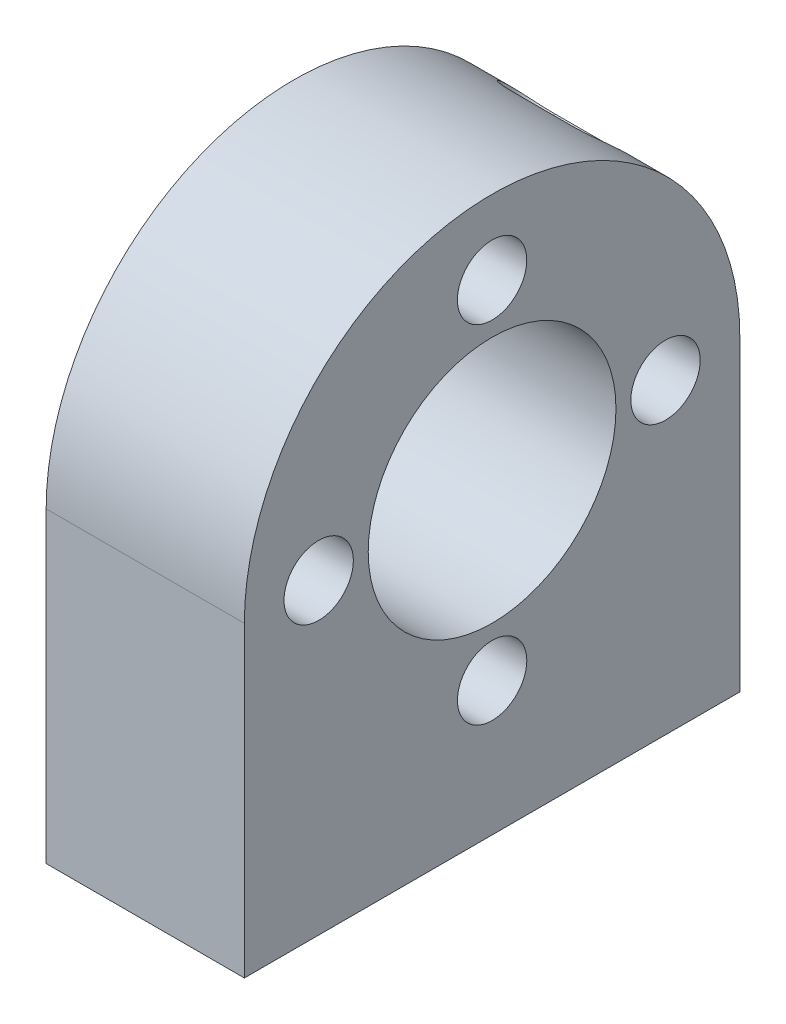
ISO-10303-21;
HEADER;
FILE_DESCRIPTION(('STEP AP214'),'2;1');
FILE_NAME('part.step','',(''),(''),'','','');
FILE_SCHEMA(('AUTOMOTIVE_DESIGN { 1 0 10303 214 1 1 1 1 }'));
ENDSEC;
DATA;
#1=APPLICATION_CONTEXT('core data for automotive mechanical design processes');
#2=APPLICATION_PROTOCOL_DEFINITION('international standard','automotive_design',2000,#1);
#3=PRODUCT_CONTEXT('',#1,'mechanical');
#4=PRODUCT('Part','Part','',(#3));
#5=PRODUCT_RELATED_PRODUCT_CATEGORY('part','',(#4));
#6=PRODUCT_DEFINITION_FORMATION('','',#4);
#7=PRODUCT_DEFINITION_CONTEXT('part definition',#1,'design');
#8=PRODUCT_DEFINITION('design','',#6,#7);
#9=PRODUCT_DEFINITION_SHAPE('','',#8);
#10=(LENGTH_UNIT() NAMED_UNIT(*) SI_UNIT(.MILLI.,.METRE.));
#11=(NAMED_UNIT(*) PLANE_ANGLE_UNIT() SI_UNIT($,.RADIAN.));
#12=(NAMED_UNIT(*) SI_UNIT($,.STERADIAN.) SOLID_ANGLE_UNIT());
#13=UNCERTAINTY_MEASURE_WITH_UNIT(LENGTH_MEASURE(1.E-05),#10,'distance_accuracy_value','');
#14=(GEOMETRIC_REPRESENTATION_CONTEXT(3) GLOBAL_UNCERTAINTY_ASSIGNED_CONTEXT((#13)) GLOBAL_UNIT_ASSIGNED_CONTEXT((#10,
#11,#12)) REPRESENTATION_CONTEXT('',''));
#15=CARTESIAN_POINT('',(0.,0.,0.));
#16=DIRECTION('',(0.,0.,1.));
#17=DIRECTION('',(1.,0.,0.));
#18=AXIS2_PLACEMENT_3D('',#15,#16,#17);
#19=CARTESIAN_POINT('',(10.,31.,17.5));
#20=DIRECTION('',(-1.,0.,0.));
#21=DIRECTION('',(0.,0.,1.));
#22=AXIS2_PLACEMENT_3D('',#19,#20,#21);
#23=CYLINDRICAL_SURFACE('',#22,2.00000000000001);
#24=CARTESIAN_POINT('',(-10.,31.,17.5));
#25=DIRECTION('',(-1.,0.,0.));
#26=DIRECTION('',(0.,0.,1.));
#27=AXIS2_PLACEMENT_3D('',#24,#25,#26);
#28=CIRCLE('',#27,2.00000000000001);
#29=CARTESIAN_POINT('',(-10.,31.,19.5));
#30=VERTEX_POINT('',#29);
#31=EDGE_CURVE('E339',#30,#30,#28,.T.);
#32=ORIENTED_EDGE('',*,*,#31,.T.);
#33=EDGE_LOOP('',(#32));
#34=FACE_BOUND('',#33,.T.);
#35=CARTESIAN_POINT('',(0.,31.,17.5));
#36=DIRECTION('',(1.,0.,0.));
#37=DIRECTION('',(0.,0.,-1.));
#38=AXIS2_PLACEMENT_3D('',#35,#36,#37);
#39=CIRCLE('',#38,2.00000000000001);
#40=CARTESIAN_POINT('',(0.,31.,15.5));
#41=VERTEX_POINT('',#40);
#42=EDGE_CURVE('E342',#41,#41,#39,.F.);
#43=ORIENTED_EDGE('',*,*,#42,.F.);
#44=EDGE_LOOP('',(#43));
#45=FACE_BOUND('',#44,.T.);
#46=ADVANCED_FACE('F111',(#34,#45),#23,.F.);
#47=CARTESIAN_POINT('',(10.,31.,-17.5));
#48=DIRECTION('',(-1.,0.,0.));
#49=DIRECTION('',(0.,0.,1.));
#50=AXIS2_PLACEMENT_3D('',#47,#48,#49);
#51=CYLINDRICAL_SURFACE('',#50,2.);
#52=CARTESIAN_POINT('',(-10.,31.,-17.5));
#53=DIRECTION('',(-1.,0.,0.));
#54=DIRECTION('',(0.,0.,1.));
#55=AXIS2_PLACEMENT_3D('',#52,#53,#54);
#56=CIRCLE('',#55,2.);
#57=CARTESIAN_POINT('',(-10.,31.,-15.5));
#58=VERTEX_POINT('',#57);
#59=EDGE_CURVE('E390',#58,#58,#56,.T.);
#60=ORIENTED_EDGE('',*,*,#59,.T.);
#61=EDGE_LOOP('',(#60));
#62=FACE_BOUND('',#61,.T.);
#63=CARTESIAN_POINT('',(0.,31.,-17.5));
#64=DIRECTION('',(1.,0.,0.));
#65=DIRECTION('',(0.,0.,-1.));
#66=AXIS2_PLACEMENT_3D('',#63,#64,#65);
#67=CIRCLE('',#66,2.);
#68=CARTESIAN_POINT('',(0.,31.,-19.5));
#69=VERTEX_POINT('',#68);
#70=EDGE_CURVE('E345',#69,#69,#67,.F.);
#71=ORIENTED_EDGE('',*,*,#70,.F.);
#72=EDGE_LOOP('',(#71));
#73=FACE_BOUND('',#72,.T.);
#74=ADVANCED_FACE('F326',(#62,#73),#51,.F.);
#75=CARTESIAN_POINT('',(10.,48.5,0.));
#76=DIRECTION('',(-1.,0.,0.));
#77=DIRECTION('',(0.,0.,1.));
#78=AXIS2_PLACEMENT_3D('',#75,#76,#77);
#79=CYLINDRICAL_SURFACE('',#78,2.00000000000001);
#80=CARTESIAN_POINT('',(-10.,48.5,0.));
#81=DIRECTION('',(-1.,0.,0.));
#82=DIRECTION('',(0.,0.,1.));
#83=AXIS2_PLACEMENT_3D('',#80,#81,#82);
#84=CIRCLE('',#83,2.00000000000001);
#85=CARTESIAN_POINT('',(-10.,48.5,2.));
#86=VERTEX_POINT('',#85);
#87=EDGE_CURVE('E387',#86,#86,#84,.T.);
#88=ORIENTED_EDGE('',*,*,#87,.T.);
#89=EDGE_LOOP('',(#88));
#90=FACE_BOUND('',#89,.T.);
#91=CARTESIAN_POINT('',(0.,48.5,0.));
#92=DIRECTION('',(1.,0.,0.));
#93=DIRECTION('',(0.,0.,-1.));
#94=AXIS2_PLACEMENT_3D('',#91,#92,#93);
#95=CIRCLE('',#94,2.00000000000001);
#96=CARTESIAN_POINT('',(0.,48.5,-2.00000000000001));
#97=VERTEX_POINT('',#96);
#98=EDGE_CURVE('E350',#97,#97,#95,.F.);
#99=ORIENTED_EDGE('',*,*,#98,.F.);
#100=EDGE_LOOP('',(#99));
#101=FACE_BOUND('',#100,.T.);
#102=ADVANCED_FACE('F237',(#90,#101),#79,.F.);
#103=CARTESIAN_POINT('',(10.,13.5,0.));
#104=DIRECTION('',(-1.,0.,0.));
#105=DIRECTION('',(0.,0.,1.));
#106=AXIS2_PLACEMENT_3D('',#103,#104,#105);
#107=CYLINDRICAL_SURFACE('',#106,2.00000000000001);
#108=CARTESIAN_POINT('',(-10.,13.5,0.));
#109=DIRECTION('',(-1.,0.,0.));
#110=DIRECTION('',(0.,0.,1.));
#111=AXIS2_PLACEMENT_3D('',#108,#109,#110);
#112=CIRCLE('',#111,2.00000000000001);
#113=CARTESIAN_POINT('',(-10.,13.5,2.00000000000001));
#114=VERTEX_POINT('',#113);
#115=EDGE_CURVE('E392',#114,#114,#112,.T.);
#116=ORIENTED_EDGE('',*,*,#115,.T.);
#117=EDGE_LOOP('',(#116));
#118=FACE_BOUND('',#117,.T.);
#119=CARTESIAN_POINT('',(0.,13.5,0.));
#120=DIRECTION('',(1.,0.,0.));
#121=DIRECTION('',(0.,0.,-1.));
#122=AXIS2_PLACEMENT_3D('',#119,#120,#121);
#123=CIRCLE('',#122,2.00000000000001);
#124=CARTESIAN_POINT('',(0.,13.5,-2.00000000000001));
#125=VERTEX_POINT('',#124);
#126=EDGE_CURVE('E355',#125,#125,#123,.F.);
#127=ORIENTED_EDGE('',*,*,#126,.F.);
#128=EDGE_LOOP('',(#127));
#129=FACE_BOUND('',#128,.T.);
#130=ADVANCED_FACE('F317',(#118,#129),#107,.F.);
#131=CARTESIAN_POINT('',(0.,0.,0.));
#132=DIRECTION('',(0.,-1.,0.));
#133=DIRECTION('',(0.,0.,-1.));
#134=AXIS2_PLACEMENT_3D('',#131,#132,#133);
#135=PLANE('',#134);
#136=CARTESIAN_POINT('',(0.,0.,-9.));
#137=DIRECTION('',(0.,1.,0.));
#138=DIRECTION('',(0.,0.,1.));
#139=AXIS2_PLACEMENT_3D('',#136,#137,#138);
#140=CIRCLE('',#139,1.65);
#141=CARTESIAN_POINT('',(0.,0.,-7.35));
#142=VERTEX_POINT('',#141);
#143=EDGE_CURVE('E408',#142,#142,#140,.T.);
#144=ORIENTED_EDGE('',*,*,#143,.T.);
#145=EDGE_LOOP('',(#144));
#146=FACE_BOUND('',#145,.T.);
#147=CARTESIAN_POINT('',(0.,0.,-19.));
#148=DIRECTION('',(0.,1.,0.));
#149=DIRECTION('',(0.,0.,1.));
#150=AXIS2_PLACEMENT_3D('',#147,#148,#149);
#151=CIRCLE('',#150,1.65);
#152=CARTESIAN_POINT('',(0.,0.,-17.35));
#153=VERTEX_POINT('',#152);
#154=EDGE_CURVE('E347',#153,#153,#151,.T.);
#155=ORIENTED_EDGE('',*,*,#154,.T.);
#156=EDGE_LOOP('',(#155));
#157=FACE_BOUND('',#156,.T.);
#158=DIRECTION('',(0.,0.,-1.));
#159=VECTOR('',#158,1.);
#160=CARTESIAN_POINT('',(10.,0.,25.));
#161=LINE('',#160,#159);
#162=CARTESIAN_POINT('',(10.,0.,25.));
#163=VERTEX_POINT('',#162);
#164=CARTESIAN_POINT('',(10.,0.,-25.));
#165=VERTEX_POINT('',#164);
#166=EDGE_CURVE('E374',#163,#165,#161,.T.);
#167=ORIENTED_EDGE('',*,*,#166,.F.);
#168=DIRECTION('',(1.,0.,0.));
#169=VECTOR('',#168,1.);
#170=CARTESIAN_POINT('',(-10.,0.,25.));
#171=LINE('',#170,#169);
#172=CARTESIAN_POINT('',(-10.,0.,25.));
#173=VERTEX_POINT('',#172);
#174=EDGE_CURVE('E365',#173,#163,#171,.T.);
#175=ORIENTED_EDGE('',*,*,#174,.F.);
#176=DIRECTION('',(0.,0.,1.));
#177=VECTOR('',#176,1.);
#178=CARTESIAN_POINT('',(-10.,0.,25.));
#179=LINE('',#178,#177);
#180=CARTESIAN_POINT('',(-10.,0.,-25.));
#181=VERTEX_POINT('',#180);
#182=EDGE_CURVE('E368',#181,#173,#179,.T.);
#183=ORIENTED_EDGE('',*,*,#182,.F.);
#184=DIRECTION('',(-1.,0.,0.));
#185=VECTOR('',#184,1.);
#186=CARTESIAN_POINT('',(-10.,0.,-25.));
#187=LINE('',#186,#185);
#188=EDGE_CURVE('E371',#165,#181,#187,.T.);
#189=ORIENTED_EDGE('',*,*,#188,.F.);
#190=EDGE_LOOP('',(#167,#175,#183,#189));
#191=FACE_BOUND('',#190,.T.);
#192=CARTESIAN_POINT('',(0.,0.,9.));
#193=DIRECTION('',(0.,-1.,0.));
#194=DIRECTION('',(0.,0.,-1.));
#195=AXIS2_PLACEMENT_3D('',#192,#193,#194);
#196=CIRCLE('',#195,1.65);
#197=CARTESIAN_POINT('',(0.,0.,7.35));
#198=VERTEX_POINT('',#197);
#199=EDGE_CURVE('E414',#198,#198,#196,.T.);
#200=ORIENTED_EDGE('',*,*,#199,.F.);
#201=EDGE_LOOP('',(#200));
#202=FACE_BOUND('',#201,.T.);
#203=CARTESIAN_POINT('',(0.,0.,19.));
#204=DIRECTION('',(0.,-1.,0.));
#205=DIRECTION('',(0.,0.,-1.));
#206=AXIS2_PLACEMENT_3D('',#203,#204,#205);
#207=CIRCLE('',#206,1.65);
#208=CARTESIAN_POINT('',(0.,0.,17.35));
#209=VERTEX_POINT('',#208);
#210=EDGE_CURVE('E417',#209,#209,#207,.T.);
#211=ORIENTED_EDGE('',*,*,#210,.F.);
#212=EDGE_LOOP('',(#211));
#213=FACE_BOUND('',#212,.T.);
#214=ADVANCED_FACE('F239',(#146,#157,#191,#202,#213),#135,.T.);
#215=CARTESIAN_POINT('',(10.,56.,25.));
#216=DIRECTION('',(-1.,0.,0.));
#217=DIRECTION('',(0.,0.,1.));
#218=AXIS2_PLACEMENT_3D('',#215,#216,#217);
#219=PLANE('',#218);
#220=CARTESIAN_POINT('',(10.,48.4983339335858,0.00166606641422568));
#221=DIRECTION('',(1.,0.,0.));
#222=DIRECTION('',(0.,0.,-1.));
#223=AXIS2_PLACEMENT_3D('',#220,#221,#222);
#224=CIRCLE('',#223,3.49999999999999);
#225=CARTESIAN_POINT('',(10.,48.4983339335858,-3.49833393358577));
#226=VERTEX_POINT('',#225);
#227=EDGE_CURVE('E438',#226,#226,#224,.T.);
#228=ORIENTED_EDGE('',*,*,#227,.F.);
#229=EDGE_LOOP('',(#228));
#230=FACE_BOUND('',#229,.T.);
#231=CARTESIAN_POINT('',(10.,31.,-17.5));
#232=DIRECTION('',(1.,0.,0.));
#233=DIRECTION('',(0.,0.,-1.));
#234=AXIS2_PLACEMENT_3D('',#231,#232,#233);
#235=CIRCLE('',#234,3.5);
#236=CARTESIAN_POINT('',(10.,31.,-21.));
#237=VERTEX_POINT('',#236);
#238=EDGE_CURVE('E436',#237,#237,#235,.T.);
#239=ORIENTED_EDGE('',*,*,#238,.F.);
#240=EDGE_LOOP('',(#239));
#241=FACE_BOUND('',#240,.T.);
#242=CARTESIAN_POINT('',(10.,13.4983339335858,-0.00166606641422351));
#243=DIRECTION('',(1.,0.,0.));
#244=DIRECTION('',(0.,0.,-1.));
#245=AXIS2_PLACEMENT_3D('',#242,#243,#244);
#246=CIRCLE('',#245,3.5);
#247=CARTESIAN_POINT('',(10.,13.4983339335858,-3.50166606641422));
#248=VERTEX_POINT('',#247);
#249=EDGE_CURVE('E430',#248,#248,#246,.T.);
#250=ORIENTED_EDGE('',*,*,#249,.F.);
#251=EDGE_LOOP('',(#250));
#252=FACE_BOUND('',#251,.T.);
#253=CARTESIAN_POINT('',(10.,30.9966678671715,17.5));
#254=DIRECTION('',(1.,0.,0.));
#255=DIRECTION('',(0.,0.,-1.));
#256=AXIS2_PLACEMENT_3D('',#253,#254,#255);
#257=CIRCLE('',#256,3.5);
#258=CARTESIAN_POINT('',(10.,30.9966678671715,14.));
#259=VERTEX_POINT('',#258);
#260=EDGE_CURVE('E424',#259,#259,#257,.T.);
#261=ORIENTED_EDGE('',*,*,#260,.F.);
#262=EDGE_LOOP('',(#261));
#263=FACE_BOUND('',#262,.T.);
#264=CARTESIAN_POINT('',(10.,31.,0.));
#265=DIRECTION('',(-1.,0.,0.));
#266=DIRECTION('',(0.,0.,1.));
#267=AXIS2_PLACEMENT_3D('',#264,#265,#266);
#268=CIRCLE('',#267,12.5);
#269=CARTESIAN_POINT('',(10.,31.,12.5));
#270=VERTEX_POINT('',#269);
#271=EDGE_CURVE('E395',#270,#270,#268,.T.);
#272=ORIENTED_EDGE('',*,*,#271,.T.);
#273=EDGE_LOOP('',(#272));
#274=FACE_BOUND('',#273,.T.);
#275=DIRECTION('',(0.,-1.,0.));
#276=VECTOR('',#275,1.);
#277=CARTESIAN_POINT('',(10.,56.,-25.));
#278=LINE('',#277,#276);
#279=CARTESIAN_POINT('',(10.,31.,-25.));
#280=VERTEX_POINT('',#279);
#281=EDGE_CURVE('E189',#280,#165,#278,.T.);
#282=ORIENTED_EDGE('',*,*,#281,.F.);
#283=CARTESIAN_POINT('',(10.,31.,0.));
#284=DIRECTION('',(-1.,0.,0.));
#285=DIRECTION('',(0.,0.,1.));
#286=AXIS2_PLACEMENT_3D('',#283,#284,#285);
#287=CIRCLE('',#286,25.);
#288=CARTESIAN_POINT('',(10.,31.,25.));
#289=VERTEX_POINT('',#288);
#290=EDGE_CURVE('E380',#289,#280,#287,.T.);
#291=ORIENTED_EDGE('',*,*,#290,.F.);
#292=DIRECTION('',(0.,-1.,0.));
#293=VECTOR('',#292,1.);
#294=CARTESIAN_POINT('',(10.,56.,25.));
#295=LINE('',#294,#293);
#296=EDGE_CURVE('E363',#289,#163,#295,.T.);
#297=ORIENTED_EDGE('',*,*,#296,.T.);
#298=ORIENTED_EDGE('',*,*,#166,.T.);
#299=EDGE_LOOP('',(#282,#291,#297,#298));
#300=FACE_BOUND('',#299,.T.);
#301=ADVANCED_FACE('F113',(#230,#241,#252,#263,#274,#300),#219,.F.);
#302=CARTESIAN_POINT('',(-10.,56.,25.));
#303=DIRECTION('',(1.,0.,0.));
#304=DIRECTION('',(0.,0.,-1.));
#305=AXIS2_PLACEMENT_3D('',#302,#303,#304);
#306=PLANE('',#305);
#307=CARTESIAN_POINT('',(-10.,31.,0.));
#308=DIRECTION('',(-1.,0.,0.));
#309=DIRECTION('',(0.,0.,1.));
#310=AXIS2_PLACEMENT_3D('',#307,#308,#309);
#311=CIRCLE('',#310,12.5);
#312=CARTESIAN_POINT('',(-10.,31.,12.5));
#313=VERTEX_POINT('',#312);
#314=EDGE_CURVE('E398',#313,#313,#311,.T.);
#315=ORIENTED_EDGE('',*,*,#314,.F.);
#316=EDGE_LOOP('',(#315));
#317=FACE_BOUND('',#316,.T.);
#318=ORIENTED_EDGE('',*,*,#115,.F.);
#319=EDGE_LOOP('',(#318));
#320=FACE_BOUND('',#319,.T.);
#321=ORIENTED_EDGE('',*,*,#87,.F.);
#322=EDGE_LOOP('',(#321));
#323=FACE_BOUND('',#322,.T.);
#324=ORIENTED_EDGE('',*,*,#31,.F.);
#325=EDGE_LOOP('',(#324));
#326=FACE_BOUND('',#325,.T.);
#327=ORIENTED_EDGE('',*,*,#59,.F.);
#328=EDGE_LOOP('',(#327));
#329=FACE_BOUND('',#328,.T.);
#330=CARTESIAN_POINT('',(-10.,31.,0.));
#331=DIRECTION('',(-1.,0.,0.));
#332=DIRECTION('',(0.,0.,1.));
#333=AXIS2_PLACEMENT_3D('',#330,#331,#332);
#334=CIRCLE('',#333,25.);
#335=CARTESIAN_POINT('',(-10.,31.,25.));
#336=VERTEX_POINT('',#335);
#337=CARTESIAN_POINT('',(-10.,31.,-25.));
#338=VERTEX_POINT('',#337);
#339=EDGE_CURVE('E381',#336,#338,#334,.T.);
#340=ORIENTED_EDGE('',*,*,#339,.T.);
#341=DIRECTION('',(0.,-1.,0.));
#342=VECTOR('',#341,1.);
#343=CARTESIAN_POINT('',(-10.,56.,-25.));
#344=LINE('',#343,#342);
#345=EDGE_CURVE('E359',#338,#181,#344,.T.);
#346=ORIENTED_EDGE('',*,*,#345,.T.);
#347=ORIENTED_EDGE('',*,*,#182,.T.);
#348=DIRECTION('',(0.,-1.,0.));
#349=VECTOR('',#348,1.);
#350=CARTESIAN_POINT('',(-10.,56.,25.));
#351=LINE('',#350,#349);
#352=EDGE_CURVE('E361',#336,#173,#351,.T.);
#353=ORIENTED_EDGE('',*,*,#352,.F.);
#354=EDGE_LOOP('',(#340,#346,#347,#353));
#355=FACE_BOUND('',#354,.T.);
#356=ADVANCED_FACE('F449',(#317,#320,#323,#326,#329,#355),#306,.F.);
#357=CARTESIAN_POINT('',(-10.,56.,-25.));
#358=DIRECTION('',(0.,0.,1.));
#359=DIRECTION('',(1.,0.,0.));
#360=AXIS2_PLACEMENT_3D('',#357,#358,#359);
#361=PLANE('',#360);
#362=DIRECTION('',(-1.,0.,0.));
#363=VECTOR('',#362,1.);
#364=CARTESIAN_POINT('',(10.,31.,-25.));
#365=LINE('',#364,#363);
#366=EDGE_CURVE('E383',#280,#338,#365,.T.);
#367=ORIENTED_EDGE('',*,*,#366,.F.);
#368=ORIENTED_EDGE('',*,*,#281,.T.);
#369=ORIENTED_EDGE('',*,*,#188,.T.);
#370=ORIENTED_EDGE('',*,*,#345,.F.);
#371=EDGE_LOOP('',(#367,#368,#369,#370));
#372=FACE_BOUND('',#371,.T.);
#373=ADVANCED_FACE('F465',(#372),#361,.F.);
#374=CARTESIAN_POINT('',(-10.,56.,25.));
#375=DIRECTION('',(0.,0.,-1.));
#376=DIRECTION('',(-1.,0.,0.));
#377=AXIS2_PLACEMENT_3D('',#374,#375,#376);
#378=PLANE('',#377);
#379=ORIENTED_EDGE('',*,*,#296,.F.);
#380=DIRECTION('',(-1.,0.,0.));
#381=VECTOR('',#380,1.);
#382=CARTESIAN_POINT('',(10.,31.,25.));
#383=LINE('',#382,#381);
#384=EDGE_CURVE('E377',#289,#336,#383,.T.);
#385=ORIENTED_EDGE('',*,*,#384,.T.);
#386=ORIENTED_EDGE('',*,*,#352,.T.);
#387=ORIENTED_EDGE('',*,*,#174,.T.);
#388=EDGE_LOOP('',(#379,#385,#386,#387));
#389=FACE_BOUND('',#388,.T.);
#390=ADVANCED_FACE('F235',(#389),#378,.F.);
#391=CARTESIAN_POINT('',(10.,31.,0.));
#392=DIRECTION('',(-1.,0.,0.));
#393=DIRECTION('',(0.,0.,1.));
#394=AXIS2_PLACEMENT_3D('',#391,#392,#393);
#395=CYLINDRICAL_SURFACE('',#394,25.);
#396=CARTESIAN_POINT('',(-3.,46.8832134946128,-19.3060490283369));
#397=CARTESIAN_POINT('',(-3.08418375775556,46.8832047826232,-19.3060520780563));
#398=CARTESIAN_POINT('',(-3.16836337808511,46.8859627166025,-19.3037871184803));
#399=CARTESIAN_POINT('',(-3.3361161175217,46.8969454538205,-19.2947458619569));
#400=CARTESIAN_POINT('',(-3.41968927693515,46.9051698903192,-19.2879698676485));
#401=CARTESIAN_POINT('',(-3.58556738376024,46.9270093601832,-19.269939362267));
#402=CARTESIAN_POINT('',(-3.66787340835581,46.940619518481,-19.2586889013615));
#403=CARTESIAN_POINT('',(-3.83068483952999,46.9730853445921,-19.2317702010613));
#404=CARTESIAN_POINT('',(-3.91119026049871,46.9919409704682,-19.216101996986));
#405=CARTESIAN_POINT('',(-4.14921421651808,47.0561539977386,-19.1625435697927));
#406=CARTESIAN_POINT('',(-4.30332604633585,47.1091689638531,-19.1180902504939));
#407=CARTESIAN_POINT('',(-4.59769699536192,47.2335733539294,-19.0125669609478));
#408=CARTESIAN_POINT('',(-4.73795775281242,47.3049606012905,-18.9514989590258));
#409=CARTESIAN_POINT('',(-5.0012510051771,47.4638067694599,-18.8136686551455));
#410=CARTESIAN_POINT('',(-5.12423000945276,47.5513137331495,-18.7368593590297));
#411=CARTESIAN_POINT('',(-5.34898150174102,47.7391988342958,-18.5691960876162));
#412=CARTESIAN_POINT('',(-5.45075095238441,47.8395788119457,-18.4783401039669));
#413=CARTESIAN_POINT('',(-5.63025594488004,48.0498875251657,-18.2844681585581));
#414=CARTESIAN_POINT('',(-5.70797066110408,48.1598244298731,-18.1814417661552));
#415=CARTESIAN_POINT('',(-5.83699313146028,48.3855411522417,-17.9657257136406));
#416=CARTESIAN_POINT('',(-5.88830345890687,48.5013203993129,-17.8530369964473));
#417=CARTESIAN_POINT('',(-5.9628500617051,48.7344729958298,-17.6214448828763));
#418=CARTESIAN_POINT('',(-5.98622400732308,48.8518356214705,-17.5025749999293));
#419=CARTESIAN_POINT('',(-6.00470142631358,49.085191302696,-17.2613444547566));
#420=CARTESIAN_POINT('',(-5.99980490237811,49.2011843584113,-17.1389837928634));
#421=CARTESIAN_POINT('',(-5.96198550935177,49.4281762513313,-16.8946751570166));
#422=CARTESIAN_POINT('',(-5.92914826654756,49.5391892572132,-16.7727270638204));
#423=CARTESIAN_POINT('',(-5.83655379197852,49.7537172074472,-16.5325146771091));
#424=CARTESIAN_POINT('',(-5.77679581994377,49.8572319455199,-16.41425048499));
#425=CARTESIAN_POINT('',(-5.63172821571131,50.0547873152275,-16.1845040367685));
#426=CARTESIAN_POINT('',(-5.54629391605513,50.1487786604562,-16.0730581378339));
#427=CARTESIAN_POINT('',(-5.35239441329622,50.3246396463619,-15.8611881160996));
#428=CARTESIAN_POINT('',(-5.24392908461144,50.4065092209379,-15.7607640534036));
#429=CARTESIAN_POINT('',(-5.00616738837021,50.5569749845047,-15.5736722687983));
#430=CARTESIAN_POINT('',(-4.87673660676872,50.6254787779388,-15.4871010004052));
#431=CARTESIAN_POINT('',(-4.60111486167322,50.7472185317516,-15.3315736398305));
#432=CARTESIAN_POINT('',(-4.45491903484878,50.8004500460709,-15.2626226779023));
#433=CARTESIAN_POINT('',(-4.15009904046811,50.8905737700195,-15.1449853896256));
#434=CARTESIAN_POINT('',(-3.99148809517787,50.9274830916642,-15.0962778435332));
#435=CARTESIAN_POINT('',(-3.66632020500733,50.9843211185148,-15.0209578291292));
#436=CARTESIAN_POINT('',(-3.49977595373919,51.0042760475056,-14.9943112402198));
#437=CARTESIAN_POINT('',(-3.27670424522639,51.0193112094427,-14.9742176180266));
#438=CARTESIAN_POINT('',(-3.22141703329904,51.0220965450553,-14.9704928051049));
#439=CARTESIAN_POINT('',(-3.11076099945255,51.02580543627,-14.9655314285981));
#440=CARTESIAN_POINT('',(-3.05539246644724,51.0267320823728,-14.9642907345976));
#441=CARTESIAN_POINT('',(-3.,51.0267340739208,-14.9642882334063));
#442=B_SPLINE_CURVE_WITH_KNOTS('',3,(#396,#397,#398,#399,#400,#401,#402,#403,#404,#405,#406,
#407,#408,#409,#410,#411,#412,#413,#414,#415,#416,#417,#418,#419,#420,#421,#422,#423,#424,#425,
#426,#427,#428,#429,#430,#431,#432,#433,#434,#435,#436,#437,#438,#439,#440,#441),.UNSPECIFIED.,
.F.,.F.,(4,2,2,2,2,2,2,2,2,2,2,2,2,2,2,2,2,2,2,2,2,2,4),(0.,0.252468265182436,0.504919594329395,
0.757142929466035,1.00936424815774,1.51354959654159,2.01767524056043,2.52332842105916,
3.02905396525125,3.53521612961468,4.04132895516532,4.5449372393727,5.04854547562478,
5.5506159048671,6.05270014095388,6.55726267313479,7.06182795663109,7.56976640956878,
8.0778525836368,8.58540481531502,9.09217056661027,9.25855538912025,9.42466332832176),.UNSPECIFIED.);
#443=CARTESIAN_POINT('',(-3.,46.8832134946128,-19.3060490283369));
#444=VERTEX_POINT('',#443);
#445=CARTESIAN_POINT('',(-3.,51.0267340739208,-14.9642882334063));
#446=VERTEX_POINT('',#445);
#447=EDGE_CURVE('E219',#444,#446,#442,.T.);
#448=ORIENTED_EDGE('',*,*,#447,.F.);
#449=DIRECTION('',(-1.,0.,0.));
#450=VECTOR('',#449,1.);
#451=CARTESIAN_POINT('',(10.,46.8832134946128,-19.3060490283369));
#452=LINE('',#451,#450);
#453=CARTESIAN_POINT('',(3.,46.8832134946128,-19.3060490283369));
#454=VERTEX_POINT('',#453);
#455=EDGE_CURVE('E228',#454,#444,#452,.T.);
#456=ORIENTED_EDGE('',*,*,#455,.F.);
#457=CARTESIAN_POINT('',(3.,51.0267340739208,-14.9642882334063));
#458=CARTESIAN_POINT('',(3.08389198581703,51.0267369993281,-14.9642790234467));
#459=CARTESIAN_POINT('',(3.16777959811744,51.0246057916518,-14.9671363806832));
#460=CARTESIAN_POINT('',(3.33494664488822,51.0160988197588,-14.9785139584428));
#461=CARTESIAN_POINT('',(3.41822612953662,51.0097234098352,-14.9870337062869));
#462=CARTESIAN_POINT('',(3.58350008933643,50.9927611370657,-15.009653279075));
#463=CARTESIAN_POINT('',(3.66549588591225,50.9821789478493,-15.02374691148));
#464=CARTESIAN_POINT('',(3.82769028397071,50.9568606758563,-15.0573620098825));
#465=CARTESIAN_POINT('',(3.90788889383359,50.9421246124535,-15.0768834505648));
#466=CARTESIAN_POINT('',(4.14498951440969,50.8917576557962,-15.143352227037));
#467=CARTESIAN_POINT('',(4.29849531110192,50.8499578598056,-15.1982177463289));
#468=CARTESIAN_POINT('',(4.59175826863894,50.750730872472,-15.3269432185865));
#469=CARTESIAN_POINT('',(4.73151614475344,50.6933044947268,-15.4008021826478));
#470=CARTESIAN_POINT('',(4.99441305316411,50.5634568979301,-15.5654162663251));
#471=CARTESIAN_POINT('',(5.11744291291566,50.4909443244702,-15.6562739673951));
#472=CARTESIAN_POINT('',(5.34244508583619,50.3325474940411,-15.8514470388612));
#473=CARTESIAN_POINT('',(5.44441396075565,50.2466610577687,-15.9557646020987));
#474=CARTESIAN_POINT('',(5.62495449835786,50.0627792400172,-16.1750116781339));
#475=CARTESIAN_POINT('',(5.70338925606925,49.9647175247367,-16.2899983771891));
#476=CARTESIAN_POINT('',(5.83379294682896,49.7591293113462,-16.5263295694398));
#477=CARTESIAN_POINT('',(5.88576417421311,49.6516036346914,-16.6476735104685));
#478=CARTESIAN_POINT('',(5.96153332966205,49.430244027068,-16.8924006484933));
#479=CARTESIAN_POINT('',(5.98544828901029,49.316438388796,-17.0157731819643));
#480=CARTESIAN_POINT('',(6.00474639867403,49.0851980322517,-17.2613455106907));
#481=CARTESIAN_POINT('',(6.00013019946385,48.9677633967767,-17.3835453326189));
#482=CARTESIAN_POINT('',(5.9625995355915,48.7335192822216,-17.6224315327073));
#483=CARTESIAN_POINT('',(5.92988413737606,48.6167112084559,-17.7391506179708));
#484=CARTESIAN_POINT('',(5.83735382335122,48.3864469677517,-17.9648956190367));
#485=CARTESIAN_POINT('',(5.77753898909101,48.2729907907276,-18.0739215579888));
#486=CARTESIAN_POINT('',(5.63252681670056,48.053032476654,-18.2816024603267));
#487=CARTESIAN_POINT('',(5.54732988693123,47.9465302277596,-18.3802575905292));
#488=CARTESIAN_POINT('',(5.3539694080738,47.7439730727828,-18.564971971293));
#489=CARTESIAN_POINT('',(5.24580603678715,47.6479180858285,-18.6510313193595));
#490=CARTESIAN_POINT('',(5.00891063052378,47.4690323440081,-18.809182173921));
#491=CARTESIAN_POINT('',(4.88007302983911,47.3862740752511,-18.8811975474145));
#492=CARTESIAN_POINT('',(4.60580150834794,47.2375003421153,-19.0092939087069));
#493=CARTESIAN_POINT('',(4.46036257413398,47.1714899548978,-19.0653700651116));
#494=CARTESIAN_POINT('',(4.15666673660281,47.0585183540054,-19.1606232450781));
#495=CARTESIAN_POINT('',(3.99837939208759,47.0116040632924,-19.1997586565941));
#496=CARTESIAN_POINT('',(3.67388502352724,46.9388843052148,-19.2601723482646));
#497=CARTESIAN_POINT('',(3.50769006412075,46.9130477075517,-19.2814769644839));
#498=CARTESIAN_POINT('',(3.28358444396418,46.8932117612044,-19.2978195061564));
#499=CARTESIAN_POINT('',(3.22692571653686,46.8894610737906,-19.3009075707351));
#500=CARTESIAN_POINT('',(3.11351929590108,46.8844652369684,-19.3050195237831));
#501=CARTESIAN_POINT('',(3.05677191545126,46.8832158587293,-19.3060468961609));
#502=CARTESIAN_POINT('',(3.,46.8832134946128,-19.3060490283369));
#503=B_SPLINE_CURVE_WITH_KNOTS('',3,(#457,#458,#459,#460,#461,#462,#463,#464,#465,#466,#467,
#468,#469,#470,#471,#472,#473,#474,#475,#476,#477,#478,#479,#480,#481,#482,#483,#484,#485,#486,
#487,#488,#489,#490,#491,#492,#493,#494,#495,#496,#497,#498,#499,#500,#501,#502),.UNSPECIFIED.,
.F.,.F.,(4,2,2,2,2,2,2,2,2,2,2,2,2,2,2,2,2,2,2,2,2,2,4),(0.,0.251592498131182,0.503163996728254,
0.754456783114997,1.00574839748875,1.50803405502409,2.01029356606422,2.51568797300463,
3.02116482153193,3.52952757831306,4.03784625353925,4.54403695059598,5.05021610718754,
5.55283858210574,6.05545954451351,6.55807242091992,7.06068140634337,7.56594361316619,
8.07135880893682,8.57800852177195,9.08390858629327,9.25444082287423,9.42468450535557),.UNSPECIFIED.);
#504=CARTESIAN_POINT('',(3.,51.0267340739208,-14.9642882334063));
#505=VERTEX_POINT('',#504);
#506=EDGE_CURVE('E132',#505,#454,#503,.T.);
#507=ORIENTED_EDGE('',*,*,#506,.F.);
#508=DIRECTION('',(-1.,0.,0.));
#509=VECTOR('',#508,1.);
#510=CARTESIAN_POINT('',(10.,51.0267340739208,-14.9642882334063));
#511=LINE('',#510,#509);
#512=EDGE_CURVE('E227',#446,#505,#511,.F.);
#513=ORIENTED_EDGE('',*,*,#512,.F.);
#514=EDGE_LOOP('',(#448,#456,#507,#513));
#515=FACE_BOUND('',#514,.T.);
#516=ORIENTED_EDGE('',*,*,#339,.F.);
#517=ORIENTED_EDGE('',*,*,#384,.F.);
#518=ORIENTED_EDGE('',*,*,#290,.T.);
#519=ORIENTED_EDGE('',*,*,#366,.T.);
#520=EDGE_LOOP('',(#516,#517,#518,#519));
#521=FACE_BOUND('',#520,.T.);
#522=ADVANCED_FACE('F230',(#515,#521),#395,.T.);
#523=CARTESIAN_POINT('',(10.,31.,0.));
#524=DIRECTION('',(-1.,0.,0.));
#525=DIRECTION('',(0.,0.,1.));
#526=AXIS2_PLACEMENT_3D('',#523,#524,#525);
#527=CYLINDRICAL_SURFACE('',#526,12.5);
#528=DIRECTION('',(-1.,0.,0.));
#529=VECTOR('',#528,1.);
#530=CARTESIAN_POINT('',(10.,41.9998656998273,-5.93741985931293));
#531=LINE('',#530,#529);
#532=CARTESIAN_POINT('',(-3.,41.9998656998273,-5.93741985931293));
#533=VERTEX_POINT('',#532);
#534=CARTESIAN_POINT('',(3.,41.9998656998273,-5.93741985931293));
#535=VERTEX_POINT('',#534);
#536=EDGE_CURVE('E125',#533,#535,#531,.F.);
#537=ORIENTED_EDGE('',*,*,#536,.T.);
#538=CARTESIAN_POINT('',(3.,41.9998656998273,-5.93741985931293));
#539=CARTESIAN_POINT('',(3.08241616036997,41.9998660597908,-5.93740599881184));
#540=CARTESIAN_POINT('',(3.1648262265933,41.9981819754491,-5.94053885658263));
#541=CARTESIAN_POINT('',(3.32902346395505,41.9914498916535,-5.9529925938216));
#542=CARTESIAN_POINT('',(3.41081075416227,41.9864025524306,-5.96231225877404));
#543=CARTESIAN_POINT('',(3.57299708371188,41.9729644614828,-5.98700573003448));
#544=CARTESIAN_POINT('',(3.65339889251966,41.9645814567456,-6.00236550739181));
#545=CARTESIAN_POINT('',(3.81241784940072,41.9444880494928,-6.0389248460161));
#546=CARTESIAN_POINT('',(3.89103496270928,41.9327775822202,-6.06012452093498));
#547=CARTESIAN_POINT('',(4.12335512500341,41.8926712746231,-6.13210972158769));
#548=CARTESIAN_POINT('',(4.27371253734773,41.8592853424817,-6.19131031813219));
#549=CARTESIAN_POINT('',(4.56125852995755,41.7793854823035,-6.32938953878301));
#550=CARTESIAN_POINT('',(4.69844224917007,41.7328667330526,-6.40827538834408));
#551=CARTESIAN_POINT('',(4.95963506893814,41.6255639278527,-6.58470136952518));
#552=CARTESIAN_POINT('',(5.08322711359728,41.564451152184,-6.6826599850887));
#553=CARTESIAN_POINT('',(5.3100650761643,41.4290195383402,-6.89210293598487));
#554=CARTESIAN_POINT('',(5.41330688348123,41.3546980378583,-7.00358999662649));
#555=CARTESIAN_POINT('',(5.59895971698832,41.191601165509,-7.23893783772929));
#556=CARTESIAN_POINT('',(5.68080689010001,41.1025198359689,-7.36303257782677));
#557=CARTESIAN_POINT('',(5.81781245254677,40.9125783582579,-7.61681536178204));
#558=CARTESIAN_POINT('',(5.87297492764317,40.8117200162325,-7.74650254605267));
#559=CARTESIAN_POINT('',(5.95406516853337,40.601997914292,-8.00492798179487));
#560=CARTESIAN_POINT('',(5.98044478617647,40.4932873326574,-8.13364842334721));
#561=CARTESIAN_POINT('',(6.00447054603637,40.269298921305,-8.38801484249305));
#562=CARTESIAN_POINT('',(6.00212143226608,40.154022178995,-8.51366132426004));
#563=CARTESIAN_POINT('',(5.96909246266443,39.9237133407883,-8.75467673785125));
#564=CARTESIAN_POINT('',(5.93920621108499,39.8087644451421,-8.87023476326151));
#565=CARTESIAN_POINT('',(5.8530783508089,39.579711939866,-9.09197247892491));
#566=CARTESIAN_POINT('',(5.79683705453385,39.4656083202323,-9.19815228033295));
#567=CARTESIAN_POINT('',(5.65977448569851,39.2423344452907,-9.39874661467182));
#568=CARTESIAN_POINT('',(5.57899206034436,39.1331567040483,-9.49317941184408));
#569=CARTESIAN_POINT('',(5.39510386621239,38.9233982074696,-9.66894584586018));
#570=CARTESIAN_POINT('',(5.29199583294346,38.8228183256604,-9.75027815245807));
#571=CARTESIAN_POINT('',(5.0638859066213,38.6319969085532,-9.90038833282585));
#572=CARTESIAN_POINT('',(4.93847549025318,38.5420120642098,-9.96887193022337));
#573=CARTESIAN_POINT('',(4.67061881489782,38.3784472704655,-10.090537165335));
#574=CARTESIAN_POINT('',(4.52816771544028,38.304871999347,-10.1437144405502));
#575=CARTESIAN_POINT('',(4.22863337964213,38.176684803643,-10.2348162633024));
#576=CARTESIAN_POINT('',(4.07141919492003,38.122267916961,-10.2725845253362));
#577=CARTESIAN_POINT('',(3.74808900673878,38.0360474114249,-10.3318350719328));
#578=CARTESIAN_POINT('',(3.58198535435296,38.0042132503965,-10.3533393554493));
#579=CARTESIAN_POINT('',(3.34539288310005,37.9763434028116,-10.3721116045894));
#580=CARTESIAN_POINT('',(3.27645717924804,37.970270701797,-10.3761916689369));
#581=CARTESIAN_POINT('',(3.13835831571295,37.9621768823377,-10.3816238309402));
#582=CARTESIAN_POINT('',(3.06919573715343,37.9601489354992,-10.3829805262396));
#583=CARTESIAN_POINT('',(3.,37.9601477911711,-10.3829833248954));
#584=B_SPLINE_CURVE_WITH_KNOTS('',3,(#538,#539,#540,#541,#542,#543,#544,#545,#546,#547,#548,
#549,#550,#551,#552,#553,#554,#555,#556,#557,#558,#559,#560,#561,#562,#563,#564,#565,#566,#567,
#568,#569,#570,#571,#572,#573,#574,#575,#576,#577,#578,#579,#580,#581,#582,#583),.UNSPECIFIED.,
.F.,.F.,(4,2,2,2,2,2,2,2,2,2,2,2,2,2,2,2,2,2,2,2,2,2,4),(0.,0.247161320152576,0.494274135062891,
0.740816356324838,0.987363375955018,1.47989935265079,1.97261638084506,2.4776992765418,
2.98288409077318,3.50028040327398,4.01759747082797,4.52667101851303,5.03566050335428,
5.53042507551238,6.02518378271254,6.51916336026096,7.01319306575271,7.5174352066177,
8.02182092100086,8.5312022685683,9.03989337930288,9.2477227922872,9.4552010476203),.UNSPECIFIED.);
#585=CARTESIAN_POINT('',(3.,37.9601477911711,-10.3829833248954));
#586=VERTEX_POINT('',#585);
#587=EDGE_CURVE('E12',#535,#586,#584,.T.);
#588=ORIENTED_EDGE('',*,*,#587,.T.);
#589=DIRECTION('',(-1.,0.,0.));
#590=VECTOR('',#589,1.);
#591=CARTESIAN_POINT('',(10.,37.9601477911711,-10.3829833248954));
#592=LINE('',#591,#590);
#593=CARTESIAN_POINT('',(-3.,37.9601477911711,-10.3829833248954));
#594=VERTEX_POINT('',#593);
#595=EDGE_CURVE('E182',#586,#594,#592,.T.);
#596=ORIENTED_EDGE('',*,*,#595,.T.);
#597=CARTESIAN_POINT('',(-3.,37.9601477911712,-10.3829833248954));
#598=CARTESIAN_POINT('',(-3.08359913054272,37.9601355822787,-10.3829838674927));
#599=CARTESIAN_POINT('',(-3.16719318348924,37.9631061669601,-10.381000007805));
#600=CARTESIAN_POINT('',(-3.33376591524486,37.9749203185888,-10.3730698990784));
#601=CARTESIAN_POINT('',(-3.41674467043001,37.9837631438522,-10.3671241504394));
#602=CARTESIAN_POINT('',(-3.58137930130204,38.0072115968551,-10.3512885743913));
#603=CARTESIAN_POINT('',(-3.66303697632292,38.0218085512377,-10.3414046828133));
#604=CARTESIAN_POINT('',(-3.82455527267291,38.0565718674314,-10.3177144850154));
#605=CARTESIAN_POINT('',(-3.90441588512587,38.0767382567448,-10.3039081594263));
#606=CARTESIAN_POINT('',(-4.1404807426438,38.14527079503,-10.2566189259209));
#607=CARTESIAN_POINT('',(-4.29329940075362,38.2016894132151,-10.217253270449));
#608=CARTESIAN_POINT('',(-4.5853657563175,38.3334007192344,-10.1231290964543));
#609=CARTESIAN_POINT('',(-4.72461192748197,38.4086955263913,-10.0683688494209));
#610=CARTESIAN_POINT('',(-4.98754628557988,38.5760388502574,-9.94307129399788));
#611=CARTESIAN_POINT('',(-5.11102523045285,38.6682795387724,-9.87235064004963));
#612=CARTESIAN_POINT('',(-5.33703030330298,38.8651855237175,-9.71620375136309));
#613=CARTESIAN_POINT('',(-5.43955392790619,38.9698523022404,-9.63077576189359));
#614=CARTESIAN_POINT('',(-5.62107257608782,39.1880127495215,-9.44600061741173));
#615=CARTESIAN_POINT('',(-5.69997607093498,39.3015386603077,-9.34660145407953));
#616=CARTESIAN_POINT('',(-5.83131179279257,39.5328104216375,-9.135949533641));
#617=CARTESIAN_POINT('',(-5.88374933503534,39.6505554197585,-9.0246991620861));
#618=CARTESIAN_POINT('',(-5.95978978955101,39.8837783646862,-8.79515350961983));
#619=CARTESIAN_POINT('',(-5.9839313064986,39.999256067912,-8.67703632447254));
#620=CARTESIAN_POINT('',(-6.00453548677777,40.2265141947826,-8.43498571656573));
#621=CARTESIAN_POINT('',(-6.00099986892854,40.3382948475905,-8.31105265546175));
#622=CARTESIAN_POINT('',(-5.96674091389614,40.5536379504882,-8.06255045442359));
#623=CARTESIAN_POINT('',(-5.93635026681598,40.6572841205466,-7.93800758445167));
#624=CARTESIAN_POINT('',(-5.84992892301078,40.8554568422391,-7.69058608628411));
#625=CARTESIAN_POINT('',(-5.79389585813819,40.949982550597,-7.56770761287944));
#626=CARTESIAN_POINT('',(-5.65667769249104,41.1298176998382,-7.32529845953721));
#627=CARTESIAN_POINT('',(-5.57505568614068,41.2149293528546,-7.20586863449173));
#628=CARTESIAN_POINT('',(-5.38931010202588,41.372788159723,-6.97672237139652));
#629=CARTESIAN_POINT('',(-5.28518267306277,41.445533193549,-6.86700760035282));
#630=CARTESIAN_POINT('',(-5.05388755322244,41.5798378375036,-6.65829409254286));
#631=CARTESIAN_POINT('',(-4.92615893479011,41.6410294933642,-6.55967891393861));
#632=CARTESIAN_POINT('',(-4.6530304829673,41.7492524269571,-6.38079400599847));
#633=CARTESIAN_POINT('',(-4.50762626913335,41.7962801844471,-6.30052883849802));
#634=CARTESIAN_POINT('',(-4.2032851872626,41.8758421466978,-6.16218007355406));
#635=CARTESIAN_POINT('',(-4.04438394309422,41.9084131740576,-6.10404017560924));
#636=CARTESIAN_POINT('',(-3.79943248419882,41.946366025939,-6.03553832939387));
#637=CARTESIAN_POINT('',(-3.71670099093129,41.9571985103141,-6.01582466157459));
#638=CARTESIAN_POINT('',(-3.54958556525002,41.9752403703896,-5.98284712901634));
#639=CARTESIAN_POINT('',(-3.4652024833849,41.982451562526,-5.96958003079396));
#640=CARTESIAN_POINT('',(-3.31725752813508,41.9918557188997,-5.95224147272655));
#641=CARTESIAN_POINT('',(-3.25391499365678,41.9948618993011,-5.94668333193242));
#642=CARTESIAN_POINT('',(-3.12705099016887,41.9988651101859,-5.93927360360873));
#643=CARTESIAN_POINT('',(-3.06352996229234,41.9998653091416,-5.93741617079627));
#644=CARTESIAN_POINT('',(-3.,41.9998656998273,-5.93741985931293));
#645=B_SPLINE_CURVE_WITH_KNOTS('',3,(#597,#598,#599,#600,#601,#602,#603,#604,#605,#606,#607,
#608,#609,#610,#611,#612,#613,#614,#615,#616,#617,#618,#619,#620,#621,#622,#623,#624,#625,#626,
#627,#628,#629,#630,#631,#632,#633,#634,#635,#636,#637,#638,#639,#640,#641,#642,#643,#644),
.UNSPECIFIED.,.F.,.F.,(4,2,2,2,2,2,2,2,2,2,2,2,2,2,2,2,2,2,2,2,2,2,2,4),(0.,0.250712241771397,
0.501392823752877,0.751696984041611,1.00200238037653,1.50221812517176,2.00249005682302,
2.5088312238558,3.01523284433806,3.52357211435391,4.03180925248792,4.5302065340974,
5.02857286423667,5.52085046970298,6.01317354753264,6.51440790127444,7.0157280958208,
7.53101063463165,8.04642113435759,8.56051119578267,8.81744320786622,9.07424621409957,
9.26508535367239,9.45562282234336),.UNSPECIFIED.);
#646=EDGE_CURVE('E188',#594,#533,#645,.T.);
#647=ORIENTED_EDGE('',*,*,#646,.T.);
#648=EDGE_LOOP('',(#537,#588,#596,#647));
#649=FACE_BOUND('',#648,.T.);
#650=ORIENTED_EDGE('',*,*,#271,.F.);
#651=EDGE_LOOP('',(#650));
#652=FACE_BOUND('',#651,.T.);
#653=ORIENTED_EDGE('',*,*,#314,.T.);
#654=EDGE_LOOP('',(#653));
#655=FACE_BOUND('',#654,.T.);
#656=ADVANCED_FACE('F195',(#649,#652,#655),#527,.F.);
#657=CARTESIAN_POINT('',(0.,15.,-19.));
#658=DIRECTION('',(0.,-1.,0.));
#659=DIRECTION('',(0.,0.,-1.));
#660=AXIS2_PLACEMENT_3D('',#657,#658,#659);
#661=CYLINDRICAL_SURFACE('',#660,1.65);
#662=CARTESIAN_POINT('',(0.,15.,-19.));
#663=DIRECTION('',(0.,1.,0.));
#664=DIRECTION('',(0.,0.,1.));
#665=AXIS2_PLACEMENT_3D('',#662,#663,#664);
#666=CIRCLE('',#665,1.65);
#667=CARTESIAN_POINT('',(0.,15.,-17.35));
#668=VERTEX_POINT('',#667);
#669=EDGE_CURVE('E344',#668,#668,#666,.T.);
#670=ORIENTED_EDGE('',*,*,#669,.T.);
#671=EDGE_LOOP('',(#670));
#672=FACE_BOUND('',#671,.T.);
#673=ORIENTED_EDGE('',*,*,#154,.F.);
#674=EDGE_LOOP('',(#673));
#675=FACE_BOUND('',#674,.T.);
#676=ADVANCED_FACE('F311',(#672,#675),#661,.F.);
#677=CARTESIAN_POINT('',(0.,15.,-19.));
#678=DIRECTION('',(0.,1.,0.));
#679=DIRECTION('',(0.,0.,1.));
#680=AXIS2_PLACEMENT_3D('',#677,#678,#679);
#681=PLANE('',#680);
#682=ORIENTED_EDGE('',*,*,#669,.F.);
#683=EDGE_LOOP('',(#682));
#684=FACE_BOUND('',#683,.T.);
#685=ADVANCED_FACE('F306',(#684),#681,.F.);
#686=CARTESIAN_POINT('',(0.,15.,-9.));
#687=DIRECTION('',(0.,-1.,0.));
#688=DIRECTION('',(0.,0.,-1.));
#689=AXIS2_PLACEMENT_3D('',#686,#687,#688);
#690=CYLINDRICAL_SURFACE('',#689,1.65);
#691=CARTESIAN_POINT('',(0.,15.,-9.));
#692=DIRECTION('',(0.,1.,0.));
#693=DIRECTION('',(0.,0.,1.));
#694=AXIS2_PLACEMENT_3D('',#691,#692,#693);
#695=CIRCLE('',#694,1.65);
#696=CARTESIAN_POINT('',(0.,15.,-7.35));
#697=VERTEX_POINT('',#696);
#698=EDGE_CURVE('E405',#697,#697,#695,.T.);
#699=ORIENTED_EDGE('',*,*,#698,.T.);
#700=EDGE_LOOP('',(#699));
#701=FACE_BOUND('',#700,.T.);
#702=ORIENTED_EDGE('',*,*,#143,.F.);
#703=EDGE_LOOP('',(#702));
#704=FACE_BOUND('',#703,.T.);
#705=ADVANCED_FACE('F303',(#701,#704),#690,.F.);
#706=CARTESIAN_POINT('',(0.,15.,-9.));
#707=DIRECTION('',(0.,1.,0.));
#708=DIRECTION('',(0.,0.,1.));
#709=AXIS2_PLACEMENT_3D('',#706,#707,#708);
#710=PLANE('',#709);
#711=ORIENTED_EDGE('',*,*,#698,.F.);
#712=EDGE_LOOP('',(#711));
#713=FACE_BOUND('',#712,.T.);
#714=ADVANCED_FACE('F298',(#713),#710,.F.);
#715=CARTESIAN_POINT('',(0.,15.,9.));
#716=DIRECTION('',(0.,-1.,0.));
#717=DIRECTION('',(0.,0.,-1.));
#718=AXIS2_PLACEMENT_3D('',#715,#716,#717);
#719=CYLINDRICAL_SURFACE('',#718,1.65);
#720=CARTESIAN_POINT('',(0.,15.,9.));
#721=DIRECTION('',(0.,-1.,0.));
#722=DIRECTION('',(0.,0.,-1.));
#723=AXIS2_PLACEMENT_3D('',#720,#721,#722);
#724=CIRCLE('',#723,1.65);
#725=CARTESIAN_POINT('',(0.,15.,7.35));
#726=VERTEX_POINT('',#725);
#727=EDGE_CURVE('E411',#726,#726,#724,.T.);
#728=ORIENTED_EDGE('',*,*,#727,.F.);
#729=EDGE_LOOP('',(#728));
#730=FACE_BOUND('',#729,.T.);
#731=ORIENTED_EDGE('',*,*,#199,.T.);
#732=EDGE_LOOP('',(#731));
#733=FACE_BOUND('',#732,.T.);
#734=ADVANCED_FACE('F295',(#730,#733),#719,.F.);
#735=CARTESIAN_POINT('',(0.,15.,9.));
#736=DIRECTION('',(0.,-1.,0.));
#737=DIRECTION('',(0.,0.,-1.));
#738=AXIS2_PLACEMENT_3D('',#735,#736,#737);
#739=PLANE('',#738);
#740=ORIENTED_EDGE('',*,*,#727,.T.);
#741=EDGE_LOOP('',(#740));
#742=FACE_BOUND('',#741,.T.);
#743=ADVANCED_FACE('F293',(#742),#739,.T.);
#744=CARTESIAN_POINT('',(0.,15.,19.));
#745=DIRECTION('',(0.,-1.,0.));
#746=DIRECTION('',(0.,0.,-1.));
#747=AXIS2_PLACEMENT_3D('',#744,#745,#746);
#748=CYLINDRICAL_SURFACE('',#747,1.65);
#749=CARTESIAN_POINT('',(0.,15.,19.));
#750=DIRECTION('',(0.,-1.,0.));
#751=DIRECTION('',(0.,0.,-1.));
#752=AXIS2_PLACEMENT_3D('',#749,#750,#751);
#753=CIRCLE('',#752,1.65);
#754=CARTESIAN_POINT('',(0.,15.,17.35));
#755=VERTEX_POINT('',#754);
#756=EDGE_CURVE('E399',#755,#755,#753,.T.);
#757=ORIENTED_EDGE('',*,*,#756,.F.);
#758=EDGE_LOOP('',(#757));
#759=FACE_BOUND('',#758,.T.);
#760=ORIENTED_EDGE('',*,*,#210,.T.);
#761=EDGE_LOOP('',(#760));
#762=FACE_BOUND('',#761,.T.);
#763=ADVANCED_FACE('F289',(#759,#762),#748,.F.);
#764=CARTESIAN_POINT('',(0.,15.,19.));
#765=DIRECTION('',(0.,-1.,0.));
#766=DIRECTION('',(0.,0.,-1.));
#767=AXIS2_PLACEMENT_3D('',#764,#765,#766);
#768=PLANE('',#767);
#769=ORIENTED_EDGE('',*,*,#756,.T.);
#770=EDGE_LOOP('',(#769));
#771=FACE_BOUND('',#770,.T.);
#772=ADVANCED_FACE('F279',(#771),#768,.T.);
#773=CARTESIAN_POINT('',(0.,13.4983339335858,-0.00166606641422351));
#774=DIRECTION('',(1.,0.,0.));
#775=DIRECTION('',(0.,0.,-1.));
#776=AXIS2_PLACEMENT_3D('',#773,#774,#775);
#777=PLANE('',#776);
#778=CARTESIAN_POINT('',(0.,13.4983339335858,-0.00166606641422351));
#779=DIRECTION('',(1.,0.,0.));
#780=DIRECTION('',(0.,0.,-1.));
#781=AXIS2_PLACEMENT_3D('',#778,#779,#780);
#782=CIRCLE('',#781,3.5);
#783=CARTESIAN_POINT('',(0.,13.4983339335858,-3.50166606641422));
#784=VERTEX_POINT('',#783);
#785=EDGE_CURVE('E427',#784,#784,#782,.T.);
#786=ORIENTED_EDGE('',*,*,#785,.T.);
#787=EDGE_LOOP('',(#786));
#788=FACE_BOUND('',#787,.T.);
#789=ORIENTED_EDGE('',*,*,#126,.T.);
#790=EDGE_LOOP('',(#789));
#791=FACE_BOUND('',#790,.T.);
#792=ADVANCED_FACE('F275',(#788,#791),#777,.T.);
#793=CARTESIAN_POINT('',(0.,13.4983339335858,-0.00166606641422351));
#794=DIRECTION('',(1.,0.,0.));
#795=DIRECTION('',(0.,0.,-1.));
#796=AXIS2_PLACEMENT_3D('',#793,#794,#795);
#797=CYLINDRICAL_SURFACE('',#796,3.5);
#798=ORIENTED_EDGE('',*,*,#785,.F.);
#799=EDGE_LOOP('',(#798));
#800=FACE_BOUND('',#799,.T.);
#801=ORIENTED_EDGE('',*,*,#249,.T.);
#802=EDGE_LOOP('',(#801));
#803=FACE_BOUND('',#802,.T.);
#804=ADVANCED_FACE('F259',(#800,#803),#797,.F.);
#805=CARTESIAN_POINT('',(0.,48.4983339335858,0.00166606641422568));
#806=DIRECTION('',(1.,0.,0.));
#807=DIRECTION('',(0.,0.,-1.));
#808=AXIS2_PLACEMENT_3D('',#805,#806,#807);
#809=PLANE('',#808);
#810=CARTESIAN_POINT('',(0.,48.4983339335858,0.00166606641422568));
#811=DIRECTION('',(1.,0.,0.));
#812=DIRECTION('',(0.,0.,-1.));
#813=AXIS2_PLACEMENT_3D('',#810,#811,#812);
#814=CIRCLE('',#813,3.49999999999999);
#815=CARTESIAN_POINT('',(0.,48.4983339335858,-3.49833393358577));
#816=VERTEX_POINT('',#815);
#817=EDGE_CURVE('E248',#816,#816,#814,.T.);
#818=ORIENTED_EDGE('',*,*,#817,.T.);
#819=EDGE_LOOP('',(#818));
#820=FACE_BOUND('',#819,.T.);
#821=ORIENTED_EDGE('',*,*,#98,.T.);
#822=EDGE_LOOP('',(#821));
#823=FACE_BOUND('',#822,.T.);
#824=ADVANCED_FACE('F254',(#820,#823),#809,.T.);
#825=CARTESIAN_POINT('',(0.,48.4983339335858,0.00166606641422568));
#826=DIRECTION('',(1.,0.,0.));
#827=DIRECTION('',(0.,0.,-1.));
#828=AXIS2_PLACEMENT_3D('',#825,#826,#827);
#829=CYLINDRICAL_SURFACE('',#828,3.49999999999999);
#830=ORIENTED_EDGE('',*,*,#817,.F.);
#831=EDGE_LOOP('',(#830));
#832=FACE_BOUND('',#831,.T.);
#833=ORIENTED_EDGE('',*,*,#227,.T.);
#834=EDGE_LOOP('',(#833));
#835=FACE_BOUND('',#834,.T.);
#836=ADVANCED_FACE('F258',(#832,#835),#829,.F.);
#837=CARTESIAN_POINT('',(0.,31.,-17.5));
#838=DIRECTION('',(1.,0.,0.));
#839=DIRECTION('',(0.,0.,-1.));
#840=AXIS2_PLACEMENT_3D('',#837,#838,#839);
#841=PLANE('',#840);
#842=CARTESIAN_POINT('',(0.,31.,-17.5));
#843=DIRECTION('',(1.,0.,0.));
#844=DIRECTION('',(0.,0.,-1.));
#845=AXIS2_PLACEMENT_3D('',#842,#843,#844);
#846=CIRCLE('',#845,3.5);
#847=CARTESIAN_POINT('',(0.,31.,-21.));
#848=VERTEX_POINT('',#847);
#849=EDGE_CURVE('E433',#848,#848,#846,.T.);
#850=ORIENTED_EDGE('',*,*,#849,.T.);
#851=EDGE_LOOP('',(#850));
#852=FACE_BOUND('',#851,.T.);
#853=ORIENTED_EDGE('',*,*,#70,.T.);
#854=EDGE_LOOP('',(#853));
#855=FACE_BOUND('',#854,.T.);
#856=ADVANCED_FACE('F263',(#852,#855),#841,.T.);
#857=CARTESIAN_POINT('',(0.,31.,-17.5));
#858=DIRECTION('',(1.,0.,0.));
#859=DIRECTION('',(0.,0.,-1.));
#860=AXIS2_PLACEMENT_3D('',#857,#858,#859);
#861=CYLINDRICAL_SURFACE('',#860,3.5);
#862=ORIENTED_EDGE('',*,*,#849,.F.);
#863=EDGE_LOOP('',(#862));
#864=FACE_BOUND('',#863,.T.);
#865=ORIENTED_EDGE('',*,*,#238,.T.);
#866=EDGE_LOOP('',(#865));
#867=FACE_BOUND('',#866,.T.);
#868=ADVANCED_FACE('F265',(#864,#867),#861,.F.);
#869=CARTESIAN_POINT('',(0.,30.9966678671715,17.5));
#870=DIRECTION('',(1.,0.,0.));
#871=DIRECTION('',(0.,0.,-1.));
#872=AXIS2_PLACEMENT_3D('',#869,#870,#871);
#873=PLANE('',#872);
#874=CARTESIAN_POINT('',(0.,30.9966678671715,17.5));
#875=DIRECTION('',(1.,0.,0.));
#876=DIRECTION('',(0.,0.,-1.));
#877=AXIS2_PLACEMENT_3D('',#874,#875,#876);
#878=CIRCLE('',#877,3.5);
#879=CARTESIAN_POINT('',(0.,30.9966678671715,14.));
#880=VERTEX_POINT('',#879);
#881=EDGE_CURVE('E247',#880,#880,#878,.T.);
#882=ORIENTED_EDGE('',*,*,#881,.T.);
#883=EDGE_LOOP('',(#882));
#884=FACE_BOUND('',#883,.T.);
#885=ORIENTED_EDGE('',*,*,#42,.T.);
#886=EDGE_LOOP('',(#885));
#887=FACE_BOUND('',#886,.T.);
#888=ADVANCED_FACE('F268',(#884,#887),#873,.T.);
#889=CARTESIAN_POINT('',(0.,30.9966678671715,17.5));
#890=DIRECTION('',(1.,0.,0.));
#891=DIRECTION('',(0.,0.,-1.));
#892=AXIS2_PLACEMENT_3D('',#889,#890,#891);
#893=CYLINDRICAL_SURFACE('',#892,3.5);
#894=ORIENTED_EDGE('',*,*,#881,.F.);
#895=EDGE_LOOP('',(#894));
#896=FACE_BOUND('',#895,.T.);
#897=ORIENTED_EDGE('',*,*,#260,.T.);
#898=EDGE_LOOP('',(#897));
#899=FACE_BOUND('',#898,.T.);
#900=ADVANCED_FACE('F253',(#896,#899),#893,.F.);
#901=CARTESIAN_POINT('',(3.,37.0667568261899,-5.24695167279487));
#902=DIRECTION('',(0.,0.707106781186554,-0.707106781186541));
#903=DIRECTION('',(0.,0.707106781186541,0.707106781186554));
#904=AXIS2_PLACEMENT_3D('',#901,#902,#903);
#905=CYLINDRICAL_SURFACE('',#904,3.);
#906=ORIENTED_EDGE('',*,*,#506,.T.);
#907=DIRECTION('',(0.,0.707106781186554,-0.707106781186541));
#908=VECTOR('',#907,1.);
#909=CARTESIAN_POINT('',(3.,34.9454364826302,-7.36827201635453));
#910=LINE('',#909,#908);
#911=EDGE_CURVE('E184',#586,#454,#910,.T.);
#912=ORIENTED_EDGE('',*,*,#911,.F.);
#913=ORIENTED_EDGE('',*,*,#587,.F.);
#914=DIRECTION('',(0.,0.707106781186554,-0.707106781186541));
#915=VECTOR('',#914,1.);
#916=CARTESIAN_POINT('',(3.,39.1880771697495,-3.12563132923521));
#917=LINE('',#916,#915);
#918=EDGE_CURVE('E681',#535,#505,#917,.T.);
#919=ORIENTED_EDGE('',*,*,#918,.T.);
#920=EDGE_LOOP('',(#906,#912,#913,#919));
#921=FACE_BOUND('',#920,.T.);
#922=ADVANCED_FACE('F191',(#921),#905,.F.);
#923=CARTESIAN_POINT('',(3.,39.1880771697495,-3.12563132923521));
#924=DIRECTION('',(0.,0.707106781186541,0.707106781186554));
#925=DIRECTION('',(0.,-0.707106781186554,0.707106781186541));
#926=AXIS2_PLACEMENT_3D('',#923,#924,#925);
#927=PLANE('',#926);
#928=ORIENTED_EDGE('',*,*,#512,.T.);
#929=ORIENTED_EDGE('',*,*,#918,.F.);
#930=ORIENTED_EDGE('',*,*,#536,.F.);
#931=DIRECTION('',(0.,0.707106781186554,-0.707106781186541));
#932=VECTOR('',#931,1.);
#933=CARTESIAN_POINT('',(-3.,39.1880771697495,-3.12563132923521));
#934=LINE('',#933,#932);
#935=EDGE_CURVE('E682',#533,#446,#934,.T.);
#936=ORIENTED_EDGE('',*,*,#935,.T.);
#937=EDGE_LOOP('',(#928,#929,#930,#936));
#938=FACE_BOUND('',#937,.T.);
#939=ADVANCED_FACE('F215',(#938),#927,.F.);
#940=CARTESIAN_POINT('',(-3.,37.0667568261899,-5.24695167279487));
#941=DIRECTION('',(0.,0.707106781186554,-0.707106781186541));
#942=DIRECTION('',(0.,0.707106781186541,0.707106781186554));
#943=AXIS2_PLACEMENT_3D('',#940,#941,#942);
#944=CYLINDRICAL_SURFACE('',#943,3.);
#945=ORIENTED_EDGE('',*,*,#447,.T.);
#946=ORIENTED_EDGE('',*,*,#935,.F.);
#947=ORIENTED_EDGE('',*,*,#646,.F.);
#948=DIRECTION('',(0.,0.707106781186554,-0.707106781186541));
#949=VECTOR('',#948,1.);
#950=CARTESIAN_POINT('',(-3.,34.9454364826302,-7.36827201635453));
#951=LINE('',#950,#949);
#952=EDGE_CURVE('E140',#594,#444,#951,.T.);
#953=ORIENTED_EDGE('',*,*,#952,.T.);
#954=EDGE_LOOP('',(#945,#946,#947,#953));
#955=FACE_BOUND('',#954,.T.);
#956=ADVANCED_FACE('F210',(#955),#944,.F.);
#957=CARTESIAN_POINT('',(3.,34.9454364826302,-7.36827201635453));
#958=DIRECTION('',(0.,-0.707106781186541,-0.707106781186554));
#959=DIRECTION('',(0.,0.707106781186554,-0.707106781186541));
#960=AXIS2_PLACEMENT_3D('',#957,#958,#959);
#961=PLANE('',#960);
#962=ORIENTED_EDGE('',*,*,#455,.T.);
#963=ORIENTED_EDGE('',*,*,#952,.F.);
#964=ORIENTED_EDGE('',*,*,#595,.F.);
#965=ORIENTED_EDGE('',*,*,#911,.T.);
#966=EDGE_LOOP('',(#962,#963,#964,#965));
#967=FACE_BOUND('',#966,.T.);
#968=ADVANCED_FACE('F183',(#967),#961,.F.);
#969=CLOSED_SHELL('',(#46,#74,#102,#130,#214,#301,#356,#373,#390,#522,#656,#676,#685,#705,#714,
#734,#743,#763,#772,#792,#804,#824,#836,#856,#868,#888,#900,#922,#939,#956,#968));
#970=MANIFOLD_SOLID_BREP('B2',#969);
#971=ADVANCED_BREP_SHAPE_REPRESENTATION('',(#18,#970),#14);
#972=SHAPE_DEFINITION_REPRESENTATION(#9,#971);
ENDSEC;
END-ISO-10303-21;
